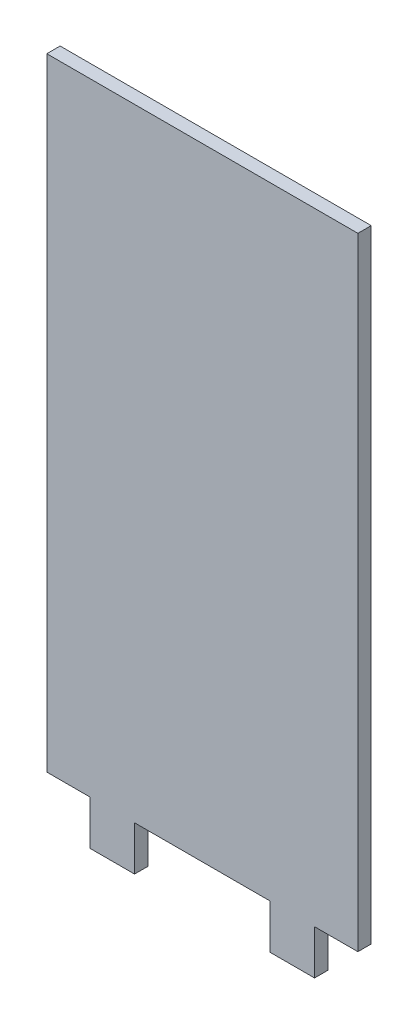
ISO-10303-21;
HEADER;
FILE_DESCRIPTION(('STEP AP214'),'2;1');
FILE_NAME('part.step','',(''),(''),'','','');
FILE_SCHEMA(('AUTOMOTIVE_DESIGN { 1 0 10303 214 1 1 1 1 }'));
ENDSEC;
DATA;
#1=APPLICATION_CONTEXT('core data for automotive mechanical design processes');
#2=APPLICATION_PROTOCOL_DEFINITION('international standard','automotive_design',2000,#1);
#3=PRODUCT_CONTEXT('',#1,'mechanical');
#4=PRODUCT('Part','Part','',(#3));
#5=PRODUCT_RELATED_PRODUCT_CATEGORY('part','',(#4));
#6=PRODUCT_DEFINITION_FORMATION('','',#4);
#7=PRODUCT_DEFINITION_CONTEXT('part definition',#1,'design');
#8=PRODUCT_DEFINITION('design','',#6,#7);
#9=PRODUCT_DEFINITION_SHAPE('','',#8);
#10=(LENGTH_UNIT() NAMED_UNIT(*) SI_UNIT(.MILLI.,.METRE.));
#11=(NAMED_UNIT(*) PLANE_ANGLE_UNIT() SI_UNIT($,.RADIAN.));
#12=(NAMED_UNIT(*) SI_UNIT($,.STERADIAN.) SOLID_ANGLE_UNIT());
#13=UNCERTAINTY_MEASURE_WITH_UNIT(LENGTH_MEASURE(1.E-05),#10,'distance_accuracy_value','');
#14=(GEOMETRIC_REPRESENTATION_CONTEXT(3) GLOBAL_UNCERTAINTY_ASSIGNED_CONTEXT((#13)) GLOBAL_UNIT_ASSIGNED_CONTEXT((#10,
#11,#12)) REPRESENTATION_CONTEXT('',''));
#15=CARTESIAN_POINT('',(0.,0.,0.));
#16=DIRECTION('',(0.,0.,1.));
#17=DIRECTION('',(1.,0.,0.));
#18=AXIS2_PLACEMENT_3D('',#15,#16,#17);
#19=CARTESIAN_POINT('',(0.,0.,1.5));
#20=DIRECTION('',(0.,1.,0.));
#21=DIRECTION('',(0.,0.,1.));
#22=AXIS2_PLACEMENT_3D('',#19,#20,#21);
#23=PLANE('',#22);
#24=DIRECTION('',(1.,0.,0.));
#25=VECTOR('',#24,1.);
#26=CARTESIAN_POINT('',(0.,0.,1.5));
#27=LINE('',#26,#25);
#28=CARTESIAN_POINT('',(4.875,0.,1.5));
#29=VERTEX_POINT('',#28);
#30=CARTESIAN_POINT('',(9.875,0.,1.5));
#31=VERTEX_POINT('',#30);
#32=EDGE_CURVE('E156',#29,#31,#27,.T.);
#33=ORIENTED_EDGE('',*,*,#32,.F.);
#34=DIRECTION('',(0.,0.,1.));
#35=VECTOR('',#34,1.);
#36=CARTESIAN_POINT('',(4.875,0.,-18.5));
#37=LINE('',#36,#35);
#38=CARTESIAN_POINT('',(4.875,0.,0.));
#39=VERTEX_POINT('',#38);
#40=EDGE_CURVE('E137',#39,#29,#37,.T.);
#41=ORIENTED_EDGE('',*,*,#40,.F.);
#42=DIRECTION('',(1.,0.,0.));
#43=VECTOR('',#42,1.);
#44=CARTESIAN_POINT('',(0.,0.,0.));
#45=LINE('',#44,#43);
#46=CARTESIAN_POINT('',(9.875,0.,0.));
#47=VERTEX_POINT('',#46);
#48=EDGE_CURVE('E181',#39,#47,#45,.T.);
#49=ORIENTED_EDGE('',*,*,#48,.T.);
#50=DIRECTION('',(0.,0.,1.));
#51=VECTOR('',#50,1.);
#52=CARTESIAN_POINT('',(9.875,0.,-18.5));
#53=LINE('',#52,#51);
#54=EDGE_CURVE('E243',#47,#31,#53,.T.);
#55=ORIENTED_EDGE('',*,*,#54,.T.);
#56=EDGE_LOOP('',(#33,#41,#49,#55));
#57=FACE_BOUND('',#56,.T.);
#58=ADVANCED_FACE('F39',(#57),#23,.F.);
#59=CARTESIAN_POINT('',(0.,0.,1.5));
#60=DIRECTION('',(1.,0.,0.));
#61=DIRECTION('',(0.,1.,0.));
#62=AXIS2_PLACEMENT_3D('',#59,#60,#61);
#63=PLANE('',#62);
#64=DIRECTION('',(0.,-1.,0.));
#65=VECTOR('',#64,1.);
#66=CARTESIAN_POINT('',(0.,0.,0.));
#67=LINE('',#66,#65);
#68=CARTESIAN_POINT('',(0.,75.,0.));
#69=VERTEX_POINT('',#68);
#70=CARTESIAN_POINT('',(0.,5.,0.));
#71=VERTEX_POINT('',#70);
#72=EDGE_CURVE('E174',#69,#71,#67,.T.);
#73=ORIENTED_EDGE('',*,*,#72,.T.);
#74=DIRECTION('',(0.,0.,1.));
#75=VECTOR('',#74,1.);
#76=CARTESIAN_POINT('',(0.,5.,-18.5));
#77=LINE('',#76,#75);
#78=CARTESIAN_POINT('',(0.,5.,1.5));
#79=VERTEX_POINT('',#78);
#80=EDGE_CURVE('E216',#71,#79,#77,.T.);
#81=ORIENTED_EDGE('',*,*,#80,.T.);
#82=DIRECTION('',(0.,-1.,0.));
#83=VECTOR('',#82,1.);
#84=CARTESIAN_POINT('',(0.,0.,1.5));
#85=LINE('',#84,#83);
#86=CARTESIAN_POINT('',(0.,75.,1.5));
#87=VERTEX_POINT('',#86);
#88=EDGE_CURVE('E157',#87,#79,#85,.T.);
#89=ORIENTED_EDGE('',*,*,#88,.F.);
#90=DIRECTION('',(0.,0.,-1.));
#91=VECTOR('',#90,1.);
#92=CARTESIAN_POINT('',(0.,75.,1.5));
#93=LINE('',#92,#91);
#94=EDGE_CURVE('E173',#87,#69,#93,.T.);
#95=ORIENTED_EDGE('',*,*,#94,.T.);
#96=EDGE_LOOP('',(#73,#81,#89,#95));
#97=FACE_BOUND('',#96,.T.);
#98=ADVANCED_FACE('F41',(#97),#63,.F.);
#99=CARTESIAN_POINT('',(25.125,0.,0.));
#100=VERTEX_POINT('',#99);
#101=CARTESIAN_POINT('',(30.125,0.,0.));
#102=VERTEX_POINT('',#101);
#103=EDGE_CURVE('E146',#100,#102,#45,.T.);
#104=ORIENTED_EDGE('',*,*,#103,.T.);
#105=DIRECTION('',(0.,0.,1.));
#106=VECTOR('',#105,1.);
#107=CARTESIAN_POINT('',(30.125,0.,-18.5));
#108=LINE('',#107,#106);
#109=CARTESIAN_POINT('',(30.125,0.,1.5));
#110=VERTEX_POINT('',#109);
#111=EDGE_CURVE('E130',#102,#110,#108,.T.);
#112=ORIENTED_EDGE('',*,*,#111,.T.);
#113=CARTESIAN_POINT('',(25.125,0.,1.5));
#114=VERTEX_POINT('',#113);
#115=EDGE_CURVE('E144',#114,#110,#27,.T.);
#116=ORIENTED_EDGE('',*,*,#115,.F.);
#117=DIRECTION('',(0.,0.,1.));
#118=VECTOR('',#117,1.);
#119=CARTESIAN_POINT('',(25.125,0.,-18.5));
#120=LINE('',#119,#118);
#121=EDGE_CURVE('E240',#100,#114,#120,.T.);
#122=ORIENTED_EDGE('',*,*,#121,.F.);
#123=EDGE_LOOP('',(#104,#112,#116,#122));
#124=FACE_BOUND('',#123,.T.);
#125=ADVANCED_FACE('F142',(#124),#23,.F.);
#126=CARTESIAN_POINT('',(35.,0.,1.5));
#127=DIRECTION('',(-1.,0.,0.));
#128=DIRECTION('',(0.,-1.,0.));
#129=AXIS2_PLACEMENT_3D('',#126,#127,#128);
#130=PLANE('',#129);
#131=DIRECTION('',(0.,1.,0.));
#132=VECTOR('',#131,1.);
#133=CARTESIAN_POINT('',(35.,0.,1.5));
#134=LINE('',#133,#132);
#135=CARTESIAN_POINT('',(35.,5.,1.5));
#136=VERTEX_POINT('',#135);
#137=CARTESIAN_POINT('',(35.,75.,1.5));
#138=VERTEX_POINT('',#137);
#139=EDGE_CURVE('E162',#136,#138,#134,.T.);
#140=ORIENTED_EDGE('',*,*,#139,.F.);
#141=DIRECTION('',(0.,0.,1.));
#142=VECTOR('',#141,1.);
#143=CARTESIAN_POINT('',(35.,5.,-18.5));
#144=LINE('',#143,#142);
#145=CARTESIAN_POINT('',(35.,5.,0.));
#146=VERTEX_POINT('',#145);
#147=EDGE_CURVE('E148',#146,#136,#144,.T.);
#148=ORIENTED_EDGE('',*,*,#147,.F.);
#149=DIRECTION('',(0.,1.,0.));
#150=VECTOR('',#149,1.);
#151=CARTESIAN_POINT('',(35.,0.,0.));
#152=LINE('',#151,#150);
#153=CARTESIAN_POINT('',(35.,75.,0.));
#154=VERTEX_POINT('',#153);
#155=EDGE_CURVE('E182',#146,#154,#152,.T.);
#156=ORIENTED_EDGE('',*,*,#155,.T.);
#157=DIRECTION('',(0.,0.,-1.));
#158=VECTOR('',#157,1.);
#159=CARTESIAN_POINT('',(35.,75.,1.5));
#160=LINE('',#159,#158);
#161=EDGE_CURVE('E190',#138,#154,#160,.T.);
#162=ORIENTED_EDGE('',*,*,#161,.F.);
#163=EDGE_LOOP('',(#140,#148,#156,#162));
#164=FACE_BOUND('',#163,.T.);
#165=ADVANCED_FACE('F281',(#164),#130,.F.);
#166=CARTESIAN_POINT('',(0.,75.,1.5));
#167=DIRECTION('',(0.,-1.,0.));
#168=DIRECTION('',(0.,0.,-1.));
#169=AXIS2_PLACEMENT_3D('',#166,#167,#168);
#170=PLANE('',#169);
#171=DIRECTION('',(-1.,0.,0.));
#172=VECTOR('',#171,1.);
#173=CARTESIAN_POINT('',(0.,75.,0.));
#174=LINE('',#173,#172);
#175=EDGE_CURVE('E164',#154,#69,#174,.T.);
#176=ORIENTED_EDGE('',*,*,#175,.T.);
#177=ORIENTED_EDGE('',*,*,#94,.F.);
#178=DIRECTION('',(-1.,0.,0.));
#179=VECTOR('',#178,1.);
#180=CARTESIAN_POINT('',(0.,75.,1.5));
#181=LINE('',#180,#179);
#182=EDGE_CURVE('E170',#138,#87,#181,.T.);
#183=ORIENTED_EDGE('',*,*,#182,.F.);
#184=ORIENTED_EDGE('',*,*,#161,.T.);
#185=EDGE_LOOP('',(#176,#177,#183,#184));
#186=FACE_BOUND('',#185,.T.);
#187=ADVANCED_FACE('F275',(#186),#170,.F.);
#188=CARTESIAN_POINT('',(0.,0.,1.5));
#189=DIRECTION('',(0.,0.,-1.));
#190=DIRECTION('',(-1.,0.,0.));
#191=AXIS2_PLACEMENT_3D('',#188,#189,#190);
#192=PLANE('',#191);
#193=DIRECTION('',(-1.,0.,0.));
#194=VECTOR('',#193,1.);
#195=CARTESIAN_POINT('',(4.875,5.,1.5));
#196=LINE('',#195,#194);
#197=CARTESIAN_POINT('',(4.875,5.,1.5));
#198=VERTEX_POINT('',#197);
#199=EDGE_CURVE('E226',#198,#79,#196,.T.);
#200=ORIENTED_EDGE('',*,*,#199,.F.);
#201=DIRECTION('',(0.,1.,0.));
#202=VECTOR('',#201,1.);
#203=CARTESIAN_POINT('',(4.875,5.,1.5));
#204=LINE('',#203,#202);
#205=EDGE_CURVE('E224',#29,#198,#204,.T.);
#206=ORIENTED_EDGE('',*,*,#205,.F.);
#207=ORIENTED_EDGE('',*,*,#32,.T.);
#208=DIRECTION('',(0.,-1.,0.));
#209=VECTOR('',#208,1.);
#210=CARTESIAN_POINT('',(9.875,0.,1.5));
#211=LINE('',#210,#209);
#212=CARTESIAN_POINT('',(9.875,5.,1.5));
#213=VERTEX_POINT('',#212);
#214=EDGE_CURVE('E251',#213,#31,#211,.T.);
#215=ORIENTED_EDGE('',*,*,#214,.F.);
#216=DIRECTION('',(-1.,0.,0.));
#217=VECTOR('',#216,1.);
#218=CARTESIAN_POINT('',(9.875,5.,1.5));
#219=LINE('',#218,#217);
#220=CARTESIAN_POINT('',(25.125,5.,1.5));
#221=VERTEX_POINT('',#220);
#222=EDGE_CURVE('E246',#221,#213,#219,.T.);
#223=ORIENTED_EDGE('',*,*,#222,.F.);
#224=DIRECTION('',(0.,1.,0.));
#225=VECTOR('',#224,1.);
#226=CARTESIAN_POINT('',(25.125,0.,1.5));
#227=LINE('',#226,#225);
#228=EDGE_CURVE('E154',#114,#221,#227,.T.);
#229=ORIENTED_EDGE('',*,*,#228,.F.);
#230=ORIENTED_EDGE('',*,*,#115,.T.);
#231=DIRECTION('',(0.,-1.,0.));
#232=VECTOR('',#231,1.);
#233=CARTESIAN_POINT('',(30.125,5.,1.5));
#234=LINE('',#233,#232);
#235=CARTESIAN_POINT('',(30.125,5.,1.5));
#236=VERTEX_POINT('',#235);
#237=EDGE_CURVE('E127',#236,#110,#234,.T.);
#238=ORIENTED_EDGE('',*,*,#237,.F.);
#239=DIRECTION('',(-1.,0.,0.));
#240=VECTOR('',#239,1.);
#241=CARTESIAN_POINT('',(30.125,5.,1.5));
#242=LINE('',#241,#240);
#243=EDGE_CURVE('E136',#136,#236,#242,.T.);
#244=ORIENTED_EDGE('',*,*,#243,.F.);
#245=ORIENTED_EDGE('',*,*,#139,.T.);
#246=ORIENTED_EDGE('',*,*,#182,.T.);
#247=ORIENTED_EDGE('',*,*,#88,.T.);
#248=EDGE_LOOP('',(#200,#206,#207,#215,#223,#229,#230,#238,#244,#245,#246,#247));
#249=FACE_BOUND('',#248,.T.);
#250=ADVANCED_FACE('F152',(#249),#192,.F.);
#251=CARTESIAN_POINT('',(0.,0.,0.));
#252=DIRECTION('',(0.,0.,-1.));
#253=DIRECTION('',(-1.,0.,0.));
#254=AXIS2_PLACEMENT_3D('',#251,#252,#253);
#255=PLANE('',#254);
#256=DIRECTION('',(0.,-1.,0.));
#257=VECTOR('',#256,1.);
#258=CARTESIAN_POINT('',(4.875,0.,0.));
#259=LINE('',#258,#257);
#260=CARTESIAN_POINT('',(4.875,5.,0.));
#261=VERTEX_POINT('',#260);
#262=EDGE_CURVE('E11',#261,#39,#259,.T.);
#263=ORIENTED_EDGE('',*,*,#262,.F.);
#264=DIRECTION('',(1.,0.,0.));
#265=VECTOR('',#264,1.);
#266=CARTESIAN_POINT('',(0.,5.,0.));
#267=LINE('',#266,#265);
#268=EDGE_CURVE('E48',#71,#261,#267,.T.);
#269=ORIENTED_EDGE('',*,*,#268,.F.);
#270=ORIENTED_EDGE('',*,*,#72,.F.);
#271=ORIENTED_EDGE('',*,*,#175,.F.);
#272=ORIENTED_EDGE('',*,*,#155,.F.);
#273=DIRECTION('',(1.,0.,0.));
#274=VECTOR('',#273,1.);
#275=CARTESIAN_POINT('',(0.,5.,0.));
#276=LINE('',#275,#274);
#277=CARTESIAN_POINT('',(30.125,5.,0.));
#278=VERTEX_POINT('',#277);
#279=EDGE_CURVE('E203',#278,#146,#276,.T.);
#280=ORIENTED_EDGE('',*,*,#279,.F.);
#281=DIRECTION('',(0.,1.,0.));
#282=VECTOR('',#281,1.);
#283=CARTESIAN_POINT('',(30.125,0.,0.));
#284=LINE('',#283,#282);
#285=EDGE_CURVE('E206',#102,#278,#284,.T.);
#286=ORIENTED_EDGE('',*,*,#285,.F.);
#287=ORIENTED_EDGE('',*,*,#103,.F.);
#288=DIRECTION('',(0.,-1.,0.));
#289=VECTOR('',#288,1.);
#290=CARTESIAN_POINT('',(25.125,0.,0.));
#291=LINE('',#290,#289);
#292=CARTESIAN_POINT('',(25.125,5.,0.));
#293=VERTEX_POINT('',#292);
#294=EDGE_CURVE('E194',#293,#100,#291,.T.);
#295=ORIENTED_EDGE('',*,*,#294,.F.);
#296=DIRECTION('',(1.,0.,0.));
#297=VECTOR('',#296,1.);
#298=CARTESIAN_POINT('',(0.,5.,0.));
#299=LINE('',#298,#297);
#300=CARTESIAN_POINT('',(9.875,5.,0.));
#301=VERTEX_POINT('',#300);
#302=EDGE_CURVE('E197',#301,#293,#299,.T.);
#303=ORIENTED_EDGE('',*,*,#302,.F.);
#304=DIRECTION('',(0.,1.,0.));
#305=VECTOR('',#304,1.);
#306=CARTESIAN_POINT('',(9.875,0.,0.));
#307=LINE('',#306,#305);
#308=EDGE_CURVE('E200',#47,#301,#307,.T.);
#309=ORIENTED_EDGE('',*,*,#308,.F.);
#310=ORIENTED_EDGE('',*,*,#48,.F.);
#311=EDGE_LOOP('',(#263,#269,#270,#271,#272,#280,#286,#287,#295,#303,#309,#310));
#312=FACE_BOUND('',#311,.T.);
#313=ADVANCED_FACE('F229',(#312),#255,.T.);
#314=CARTESIAN_POINT('',(9.875,0.,-18.5));
#315=DIRECTION('',(-1.,0.,0.));
#316=DIRECTION('',(0.,-1.,0.));
#317=AXIS2_PLACEMENT_3D('',#314,#315,#316);
#318=PLANE('',#317);
#319=ORIENTED_EDGE('',*,*,#308,.T.);
#320=DIRECTION('',(0.,0.,1.));
#321=VECTOR('',#320,1.);
#322=CARTESIAN_POINT('',(9.875,5.,-18.5));
#323=LINE('',#322,#321);
#324=EDGE_CURVE('E178',#301,#213,#323,.T.);
#325=ORIENTED_EDGE('',*,*,#324,.T.);
#326=ORIENTED_EDGE('',*,*,#214,.T.);
#327=ORIENTED_EDGE('',*,*,#54,.F.);
#328=EDGE_LOOP('',(#319,#325,#326,#327));
#329=FACE_BOUND('',#328,.T.);
#330=ADVANCED_FACE('F309',(#329),#318,.F.);
#331=CARTESIAN_POINT('',(9.875,5.,-18.5));
#332=DIRECTION('',(0.,1.,0.));
#333=DIRECTION('',(0.,0.,1.));
#334=AXIS2_PLACEMENT_3D('',#331,#332,#333);
#335=PLANE('',#334);
#336=ORIENTED_EDGE('',*,*,#302,.T.);
#337=DIRECTION('',(0.,0.,1.));
#338=VECTOR('',#337,1.);
#339=CARTESIAN_POINT('',(25.125,5.,-18.5));
#340=LINE('',#339,#338);
#341=EDGE_CURVE('E63',#293,#221,#340,.T.);
#342=ORIENTED_EDGE('',*,*,#341,.T.);
#343=ORIENTED_EDGE('',*,*,#222,.T.);
#344=ORIENTED_EDGE('',*,*,#324,.F.);
#345=EDGE_LOOP('',(#336,#342,#343,#344));
#346=FACE_BOUND('',#345,.T.);
#347=ADVANCED_FACE('F314',(#346),#335,.F.);
#348=CARTESIAN_POINT('',(25.125,0.,-18.5));
#349=DIRECTION('',(1.,0.,0.));
#350=DIRECTION('',(0.,0.,-1.));
#351=AXIS2_PLACEMENT_3D('',#348,#349,#350);
#352=PLANE('',#351);
#353=ORIENTED_EDGE('',*,*,#294,.T.);
#354=ORIENTED_EDGE('',*,*,#121,.T.);
#355=ORIENTED_EDGE('',*,*,#228,.T.);
#356=ORIENTED_EDGE('',*,*,#341,.F.);
#357=EDGE_LOOP('',(#353,#354,#355,#356));
#358=FACE_BOUND('',#357,.T.);
#359=ADVANCED_FACE('F290',(#358),#352,.F.);
#360=CARTESIAN_POINT('',(30.125,5.,-18.5));
#361=DIRECTION('',(-1.,0.,0.));
#362=DIRECTION('',(0.,0.,1.));
#363=AXIS2_PLACEMENT_3D('',#360,#361,#362);
#364=PLANE('',#363);
#365=ORIENTED_EDGE('',*,*,#285,.T.);
#366=DIRECTION('',(0.,0.,1.));
#367=VECTOR('',#366,1.);
#368=CARTESIAN_POINT('',(30.125,5.,-18.5));
#369=LINE('',#368,#367);
#370=EDGE_CURVE('E55',#278,#236,#369,.T.);
#371=ORIENTED_EDGE('',*,*,#370,.T.);
#372=ORIENTED_EDGE('',*,*,#237,.T.);
#373=ORIENTED_EDGE('',*,*,#111,.F.);
#374=EDGE_LOOP('',(#365,#371,#372,#373));
#375=FACE_BOUND('',#374,.T.);
#376=ADVANCED_FACE('F129',(#375),#364,.F.);
#377=CARTESIAN_POINT('',(30.125,5.,-18.5));
#378=DIRECTION('',(0.,1.,0.));
#379=DIRECTION('',(0.,0.,1.));
#380=AXIS2_PLACEMENT_3D('',#377,#378,#379);
#381=PLANE('',#380);
#382=ORIENTED_EDGE('',*,*,#279,.T.);
#383=ORIENTED_EDGE('',*,*,#147,.T.);
#384=ORIENTED_EDGE('',*,*,#243,.T.);
#385=ORIENTED_EDGE('',*,*,#370,.F.);
#386=EDGE_LOOP('',(#382,#383,#384,#385));
#387=FACE_BOUND('',#386,.T.);
#388=ADVANCED_FACE('F282',(#387),#381,.F.);
#389=CARTESIAN_POINT('',(4.875,5.,-18.5));
#390=DIRECTION('',(1.,0.,0.));
#391=DIRECTION('',(0.,1.,0.));
#392=AXIS2_PLACEMENT_3D('',#389,#390,#391);
#393=PLANE('',#392);
#394=ORIENTED_EDGE('',*,*,#262,.T.);
#395=ORIENTED_EDGE('',*,*,#40,.T.);
#396=ORIENTED_EDGE('',*,*,#205,.T.);
#397=DIRECTION('',(0.,0.,1.));
#398=VECTOR('',#397,1.);
#399=CARTESIAN_POINT('',(4.875,5.,-18.5));
#400=LINE('',#399,#398);
#401=EDGE_CURVE('E213',#261,#198,#400,.T.);
#402=ORIENTED_EDGE('',*,*,#401,.F.);
#403=EDGE_LOOP('',(#394,#395,#396,#402));
#404=FACE_BOUND('',#403,.T.);
#405=ADVANCED_FACE('F221',(#404),#393,.F.);
#406=CARTESIAN_POINT('',(4.875,5.,-18.5));
#407=DIRECTION('',(0.,1.,0.));
#408=DIRECTION('',(-1.,0.,0.));
#409=AXIS2_PLACEMENT_3D('',#406,#407,#408);
#410=PLANE('',#409);
#411=ORIENTED_EDGE('',*,*,#268,.T.);
#412=ORIENTED_EDGE('',*,*,#401,.T.);
#413=ORIENTED_EDGE('',*,*,#199,.T.);
#414=ORIENTED_EDGE('',*,*,#80,.F.);
#415=EDGE_LOOP('',(#411,#412,#413,#414));
#416=FACE_BOUND('',#415,.T.);
#417=ADVANCED_FACE('F212',(#416),#410,.F.);
#418=CLOSED_SHELL('',(#58,#98,#125,#165,#187,#250,#313,#330,#347,#359,#376,#388,#405,#417));
#419=MANIFOLD_SOLID_BREP('B2',#418);
#420=ADVANCED_BREP_SHAPE_REPRESENTATION('',(#18,#419),#14);
#421=SHAPE_DEFINITION_REPRESENTATION(#9,#420);
ENDSEC;
END-ISO-10303-21;
